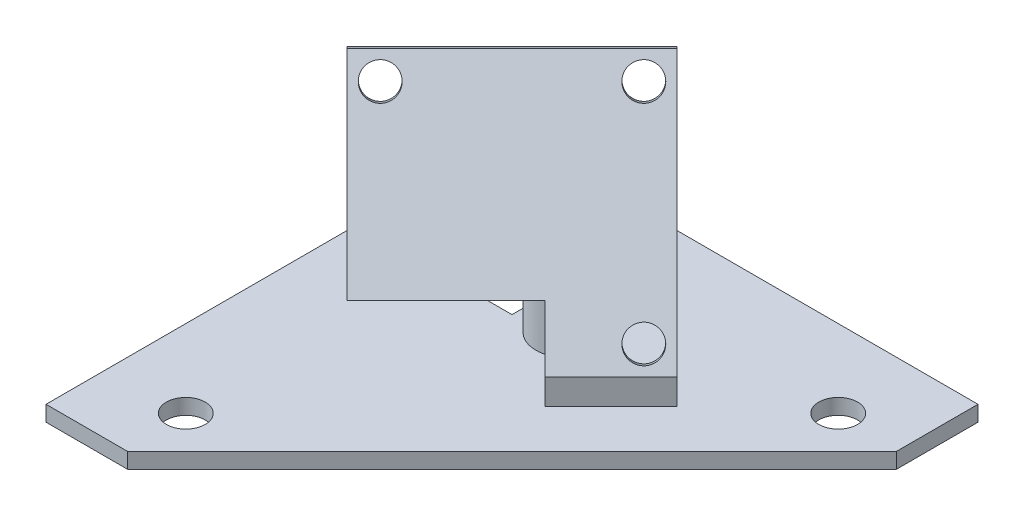
ISO-10303-21;
HEADER;
FILE_DESCRIPTION(('STEP AP214'),'2;1');
FILE_NAME('part.step','',(''),(''),'','','');
FILE_SCHEMA(('AUTOMOTIVE_DESIGN { 1 0 10303 214 1 1 1 1 }'));
ENDSEC;
DATA;
#1=APPLICATION_CONTEXT('core data for automotive mechanical design processes');
#2=APPLICATION_PROTOCOL_DEFINITION('international standard','automotive_design',2000,#1);
#3=PRODUCT_CONTEXT('',#1,'mechanical');
#4=PRODUCT('Part','Part','',(#3));
#5=PRODUCT_RELATED_PRODUCT_CATEGORY('part','',(#4));
#6=PRODUCT_DEFINITION_FORMATION('','',#4);
#7=PRODUCT_DEFINITION_CONTEXT('part definition',#1,'design');
#8=PRODUCT_DEFINITION('design','',#6,#7);
#9=PRODUCT_DEFINITION_SHAPE('','',#8);
#10=(LENGTH_UNIT() NAMED_UNIT(*) SI_UNIT(.MILLI.,.METRE.));
#11=(NAMED_UNIT(*) PLANE_ANGLE_UNIT() SI_UNIT($,.RADIAN.));
#12=(NAMED_UNIT(*) SI_UNIT($,.STERADIAN.) SOLID_ANGLE_UNIT());
#13=UNCERTAINTY_MEASURE_WITH_UNIT(LENGTH_MEASURE(1.E-05),#10,'distance_accuracy_value','');
#14=(GEOMETRIC_REPRESENTATION_CONTEXT(3) GLOBAL_UNCERTAINTY_ASSIGNED_CONTEXT((#13)) GLOBAL_UNIT_ASSIGNED_CONTEXT((#10,
#11,#12)) REPRESENTATION_CONTEXT('',''));
#15=CARTESIAN_POINT('',(0.,0.,0.));
#16=DIRECTION('',(0.,0.,1.));
#17=DIRECTION('',(1.,0.,0.));
#18=AXIS2_PLACEMENT_3D('',#15,#16,#17);
#19=CARTESIAN_POINT('',(0.,2.,0.));
#20=DIRECTION('',(0.,1.,0.));
#21=DIRECTION('',(0.,0.,1.));
#22=AXIS2_PLACEMENT_3D('',#19,#20,#21);
#23=PLANE('',#22);
#24=CARTESIAN_POINT('',(25.5115964232404,2.,18.4405286113749));
#25=DIRECTION('',(0.,1.,0.));
#26=DIRECTION('',(0.,0.,1.));
#27=AXIS2_PLACEMENT_3D('',#24,#25,#26);
#28=CIRCLE('',#27,4.);
#29=CARTESIAN_POINT('',(25.5115964232404,2.,22.4405286113749));
#30=VERTEX_POINT('',#29);
#31=EDGE_CURVE('E193',#30,#30,#28,.T.);
#32=ORIENTED_EDGE('',*,*,#31,.F.);
#33=EDGE_LOOP('',(#32));
#34=FACE_BOUND('',#33,.T.);
#35=CARTESIAN_POINT('',(52.,2.,10.));
#36=DIRECTION('',(0.,1.,0.));
#37=DIRECTION('',(0.,0.,1.));
#38=AXIS2_PLACEMENT_3D('',#35,#36,#37);
#39=CIRCLE('',#38,2.5);
#40=CARTESIAN_POINT('',(52.,2.,12.5));
#41=VERTEX_POINT('',#40);
#42=EDGE_CURVE('E161',#41,#41,#39,.T.);
#43=ORIENTED_EDGE('',*,*,#42,.F.);
#44=EDGE_LOOP('',(#43));
#45=FACE_BOUND('',#44,.T.);
#46=CARTESIAN_POINT('',(10.,2.,52.));
#47=DIRECTION('',(0.,1.,0.));
#48=DIRECTION('',(0.,0.,1.));
#49=AXIS2_PLACEMENT_3D('',#46,#47,#48);
#50=CIRCLE('',#49,2.5);
#51=CARTESIAN_POINT('',(10.,2.,54.5));
#52=VERTEX_POINT('',#51);
#53=EDGE_CURVE('E186',#52,#52,#50,.T.);
#54=ORIENTED_EDGE('',*,*,#53,.F.);
#55=EDGE_LOOP('',(#54));
#56=FACE_BOUND('',#55,.T.);
#57=DIRECTION('',(1.,0.,0.));
#58=VECTOR('',#57,1.);
#59=CARTESIAN_POINT('',(0.,2.,0.));
#60=LINE('',#59,#58);
#61=CARTESIAN_POINT('',(20.,2.,0.));
#62=VERTEX_POINT('',#61);
#63=CARTESIAN_POINT('',(60.,2.,0.));
#64=VERTEX_POINT('',#63);
#65=EDGE_CURVE('E182',#62,#64,#60,.T.);
#66=ORIENTED_EDGE('',*,*,#65,.F.);
#67=DIRECTION('',(0.,0.,1.));
#68=VECTOR('',#67,1.);
#69=CARTESIAN_POINT('',(20.,2.,0.));
#70=LINE('',#69,#68);
#71=CARTESIAN_POINT('',(20.,2.,20.));
#72=VERTEX_POINT('',#71);
#73=EDGE_CURVE('E180',#62,#72,#70,.T.);
#74=ORIENTED_EDGE('',*,*,#73,.T.);
#75=DIRECTION('',(1.,0.,0.));
#76=VECTOR('',#75,1.);
#77=CARTESIAN_POINT('',(0.,2.,20.));
#78=LINE('',#77,#76);
#79=CARTESIAN_POINT('',(0.,2.,20.));
#80=VERTEX_POINT('',#79);
#81=EDGE_CURVE('E171',#80,#72,#78,.T.);
#82=ORIENTED_EDGE('',*,*,#81,.F.);
#83=DIRECTION('',(0.,0.,1.));
#84=VECTOR('',#83,1.);
#85=CARTESIAN_POINT('',(0.,2.,0.));
#86=LINE('',#85,#84);
#87=CARTESIAN_POINT('',(0.,2.,60.));
#88=VERTEX_POINT('',#87);
#89=EDGE_CURVE('E116',#80,#88,#86,.T.);
#90=ORIENTED_EDGE('',*,*,#89,.T.);
#91=DIRECTION('',(1.,0.,0.));
#92=VECTOR('',#91,1.);
#93=CARTESIAN_POINT('',(0.,2.,60.));
#94=LINE('',#93,#92);
#95=CARTESIAN_POINT('',(10.5025253169417,2.,60.));
#96=VERTEX_POINT('',#95);
#97=EDGE_CURVE('E107',#88,#96,#94,.T.);
#98=ORIENTED_EDGE('',*,*,#97,.T.);
#99=DIRECTION('',(-0.707106781186548,0.,0.707106781186548));
#100=VECTOR('',#99,1.);
#101=CARTESIAN_POINT('',(35.2512626584708,2.,35.2512626584708));
#102=LINE('',#101,#100);
#103=CARTESIAN_POINT('',(60.,2.,10.5025253169417));
#104=VERTEX_POINT('',#103);
#105=EDGE_CURVE('E113',#104,#96,#102,.T.);
#106=ORIENTED_EDGE('',*,*,#105,.F.);
#107=DIRECTION('',(0.,0.,1.));
#108=VECTOR('',#107,1.);
#109=CARTESIAN_POINT('',(60.,2.,0.));
#110=LINE('',#109,#108);
#111=EDGE_CURVE('E132',#64,#104,#110,.T.);
#112=ORIENTED_EDGE('',*,*,#111,.F.);
#113=EDGE_LOOP('',(#66,#74,#82,#90,#98,#106,#112));
#114=FACE_BOUND('',#113,.T.);
#115=DIRECTION('',(-0.707106781186548,0.,0.707106781186548));
#116=VECTOR('',#115,1.);
#117=CARTESIAN_POINT('',(29.0471303291731,2.,29.0471303291731));
#118=LINE('',#117,#116);
#119=CARTESIAN_POINT('',(39.6537320469713,2.,18.4405286113749));
#120=VERTEX_POINT('',#119);
#121=CARTESIAN_POINT('',(31.1684506727327,2.,26.9258099856134));
#122=VERTEX_POINT('',#121);
#123=EDGE_CURVE('E50',#120,#122,#118,.T.);
#124=ORIENTED_EDGE('',*,*,#123,.F.);
#125=DIRECTION('',(-0.707106781186548,0.,-0.707106781186548));
#126=VECTOR('',#125,1.);
#127=CARTESIAN_POINT('',(10.6066017177982,2.,-10.6066017177982));
#128=LINE('',#127,#126);
#129=CARTESIAN_POINT('',(40.8784769183629,2.,19.6652734827664));
#130=VERTEX_POINT('',#129);
#131=EDGE_CURVE('E272',#130,#120,#128,.T.);
#132=ORIENTED_EDGE('',*,*,#131,.F.);
#133=DIRECTION('',(0.707106781186548,0.,-0.707106781186548));
#134=VECTOR('',#133,1.);
#135=CARTESIAN_POINT('',(30.2718752005647,2.,30.2718752005647));
#136=LINE('',#135,#134);
#137=CARTESIAN_POINT('',(32.3931955441243,2.,28.150554857005));
#138=VERTEX_POINT('',#137);
#139=EDGE_CURVE('E275',#138,#130,#136,.T.);
#140=ORIENTED_EDGE('',*,*,#139,.F.);
#141=DIRECTION('',(0.707106781186548,0.,0.707106781186548));
#142=VECTOR('',#141,1.);
#143=CARTESIAN_POINT('',(2.12132034355965,2.,-2.12132034355965));
#144=LINE('',#143,#142);
#145=EDGE_CURVE('E278',#122,#138,#144,.T.);
#146=ORIENTED_EDGE('',*,*,#145,.F.);
#147=EDGE_LOOP('',(#124,#132,#140,#146));
#148=FACE_BOUND('',#147,.T.);
#149=ADVANCED_FACE('F35',(#34,#45,#56,#114,#148),#23,.T.);
#150=CARTESIAN_POINT('',(0.,2.,0.));
#151=DIRECTION('',(0.,0.,-1.));
#152=DIRECTION('',(-1.,0.,0.));
#153=AXIS2_PLACEMENT_3D('',#150,#151,#152);
#154=PLANE('',#153);
#155=DIRECTION('',(1.,0.,0.));
#156=VECTOR('',#155,1.);
#157=CARTESIAN_POINT('',(0.,0.,0.));
#158=LINE('',#157,#156);
#159=CARTESIAN_POINT('',(20.,0.,0.));
#160=VERTEX_POINT('',#159);
#161=CARTESIAN_POINT('',(60.,0.,0.));
#162=VERTEX_POINT('',#161);
#163=EDGE_CURVE('E144',#160,#162,#158,.T.);
#164=ORIENTED_EDGE('',*,*,#163,.F.);
#165=DIRECTION('',(0.,-1.,0.));
#166=VECTOR('',#165,1.);
#167=CARTESIAN_POINT('',(20.,2.,0.));
#168=LINE('',#167,#166);
#169=EDGE_CURVE('E11',#62,#160,#168,.T.);
#170=ORIENTED_EDGE('',*,*,#169,.F.);
#171=ORIENTED_EDGE('',*,*,#65,.T.);
#172=DIRECTION('',(0.,-1.,0.));
#173=VECTOR('',#172,1.);
#174=CARTESIAN_POINT('',(60.,2.,0.));
#175=LINE('',#174,#173);
#176=EDGE_CURVE('E59',#64,#162,#175,.T.);
#177=ORIENTED_EDGE('',*,*,#176,.T.);
#178=EDGE_LOOP('',(#164,#170,#171,#177));
#179=FACE_BOUND('',#178,.T.);
#180=ADVANCED_FACE('F360',(#179),#154,.T.);
#181=CARTESIAN_POINT('',(20.,2.,0.));
#182=DIRECTION('',(1.,0.,0.));
#183=DIRECTION('',(0.,0.,-1.));
#184=AXIS2_PLACEMENT_3D('',#181,#182,#183);
#185=PLANE('',#184);
#186=DIRECTION('',(0.,0.,1.));
#187=VECTOR('',#186,1.);
#188=CARTESIAN_POINT('',(20.,0.,0.));
#189=LINE('',#188,#187);
#190=CARTESIAN_POINT('',(20.,0.,20.));
#191=VERTEX_POINT('',#190);
#192=EDGE_CURVE('E146',#160,#191,#189,.T.);
#193=ORIENTED_EDGE('',*,*,#192,.T.);
#194=DIRECTION('',(0.,-1.,0.));
#195=VECTOR('',#194,1.);
#196=CARTESIAN_POINT('',(20.,2.,20.));
#197=LINE('',#196,#195);
#198=EDGE_CURVE('E43',#72,#191,#197,.T.);
#199=ORIENTED_EDGE('',*,*,#198,.F.);
#200=ORIENTED_EDGE('',*,*,#73,.F.);
#201=ORIENTED_EDGE('',*,*,#169,.T.);
#202=EDGE_LOOP('',(#193,#199,#200,#201));
#203=FACE_BOUND('',#202,.T.);
#204=ADVANCED_FACE('F174',(#203),#185,.F.);
#205=CARTESIAN_POINT('',(0.,2.,20.));
#206=DIRECTION('',(0.,0.,-1.));
#207=DIRECTION('',(-1.,0.,0.));
#208=AXIS2_PLACEMENT_3D('',#205,#206,#207);
#209=PLANE('',#208);
#210=DIRECTION('',(1.,0.,0.));
#211=VECTOR('',#210,1.);
#212=CARTESIAN_POINT('',(0.,0.,20.));
#213=LINE('',#212,#211);
#214=CARTESIAN_POINT('',(0.,0.,20.));
#215=VERTEX_POINT('',#214);
#216=EDGE_CURVE('E149',#215,#191,#213,.T.);
#217=ORIENTED_EDGE('',*,*,#216,.F.);
#218=DIRECTION('',(0.,-1.,0.));
#219=VECTOR('',#218,1.);
#220=CARTESIAN_POINT('',(0.,2.,20.));
#221=LINE('',#220,#219);
#222=EDGE_CURVE('E165',#80,#215,#221,.T.);
#223=ORIENTED_EDGE('',*,*,#222,.F.);
#224=ORIENTED_EDGE('',*,*,#81,.T.);
#225=ORIENTED_EDGE('',*,*,#198,.T.);
#226=EDGE_LOOP('',(#217,#223,#224,#225));
#227=FACE_BOUND('',#226,.T.);
#228=ADVANCED_FACE('F170',(#227),#209,.T.);
#229=CARTESIAN_POINT('',(0.,2.,0.));
#230=DIRECTION('',(1.,0.,0.));
#231=DIRECTION('',(0.,0.,-1.));
#232=AXIS2_PLACEMENT_3D('',#229,#230,#231);
#233=PLANE('',#232);
#234=DIRECTION('',(0.,0.,1.));
#235=VECTOR('',#234,1.);
#236=CARTESIAN_POINT('',(0.,0.,0.));
#237=LINE('',#236,#235);
#238=CARTESIAN_POINT('',(0.,0.,60.));
#239=VERTEX_POINT('',#238);
#240=EDGE_CURVE('E152',#215,#239,#237,.T.);
#241=ORIENTED_EDGE('',*,*,#240,.T.);
#242=DIRECTION('',(0.,-1.,0.));
#243=VECTOR('',#242,1.);
#244=CARTESIAN_POINT('',(0.,2.,60.));
#245=LINE('',#244,#243);
#246=EDGE_CURVE('E128',#88,#239,#245,.T.);
#247=ORIENTED_EDGE('',*,*,#246,.F.);
#248=ORIENTED_EDGE('',*,*,#89,.F.);
#249=ORIENTED_EDGE('',*,*,#222,.T.);
#250=EDGE_LOOP('',(#241,#247,#248,#249));
#251=FACE_BOUND('',#250,.T.);
#252=ADVANCED_FACE('F179',(#251),#233,.F.);
#253=CARTESIAN_POINT('',(0.,2.,60.));
#254=DIRECTION('',(0.,0.,-1.));
#255=DIRECTION('',(-1.,0.,0.));
#256=AXIS2_PLACEMENT_3D('',#253,#254,#255);
#257=PLANE('',#256);
#258=DIRECTION('',(1.,0.,0.));
#259=VECTOR('',#258,1.);
#260=CARTESIAN_POINT('',(0.,0.,60.));
#261=LINE('',#260,#259);
#262=CARTESIAN_POINT('',(10.5025253169417,0.,60.));
#263=VERTEX_POINT('',#262);
#264=EDGE_CURVE('E124',#239,#263,#261,.T.);
#265=ORIENTED_EDGE('',*,*,#264,.T.);
#266=DIRECTION('',(0.,-1.,0.));
#267=VECTOR('',#266,1.);
#268=CARTESIAN_POINT('',(10.5025253169417,2.,60.));
#269=LINE('',#268,#267);
#270=EDGE_CURVE('E122',#96,#263,#269,.T.);
#271=ORIENTED_EDGE('',*,*,#270,.F.);
#272=ORIENTED_EDGE('',*,*,#97,.F.);
#273=ORIENTED_EDGE('',*,*,#246,.T.);
#274=EDGE_LOOP('',(#265,#271,#272,#273));
#275=FACE_BOUND('',#274,.T.);
#276=ADVANCED_FACE('F123',(#275),#257,.F.);
#277=CARTESIAN_POINT('',(35.2512626584708,2.,35.2512626584708));
#278=DIRECTION('',(0.707106781186547,0.,0.707106781186547));
#279=DIRECTION('',(0.707106781186548,0.,-0.707106781186548));
#280=AXIS2_PLACEMENT_3D('',#277,#278,#279);
#281=PLANE('',#280);
#282=DIRECTION('',(-0.707106781186548,0.,0.707106781186548));
#283=VECTOR('',#282,1.);
#284=CARTESIAN_POINT('',(35.2512626584708,0.,35.2512626584708));
#285=LINE('',#284,#283);
#286=CARTESIAN_POINT('',(60.,0.,10.5025253169417));
#287=VERTEX_POINT('',#286);
#288=EDGE_CURVE('E156',#287,#263,#285,.T.);
#289=ORIENTED_EDGE('',*,*,#288,.F.);
#290=DIRECTION('',(0.,-1.,0.));
#291=VECTOR('',#290,1.);
#292=CARTESIAN_POINT('',(60.,2.,10.5025253169417));
#293=LINE('',#292,#291);
#294=EDGE_CURVE('E129',#104,#287,#293,.T.);
#295=ORIENTED_EDGE('',*,*,#294,.F.);
#296=ORIENTED_EDGE('',*,*,#105,.T.);
#297=ORIENTED_EDGE('',*,*,#270,.T.);
#298=EDGE_LOOP('',(#289,#295,#296,#297));
#299=FACE_BOUND('',#298,.T.);
#300=ADVANCED_FACE('F131',(#299),#281,.T.);
#301=CARTESIAN_POINT('',(10.,2.,52.));
#302=DIRECTION('',(0.,-1.,0.));
#303=DIRECTION('',(0.,0.,-1.));
#304=AXIS2_PLACEMENT_3D('',#301,#302,#303);
#305=CYLINDRICAL_SURFACE('',#304,2.5);
#306=ORIENTED_EDGE('',*,*,#53,.T.);
#307=EDGE_LOOP('',(#306));
#308=FACE_BOUND('',#307,.T.);
#309=CARTESIAN_POINT('',(10.,0.,52.));
#310=DIRECTION('',(0.,1.,0.));
#311=DIRECTION('',(0.,0.,1.));
#312=AXIS2_PLACEMENT_3D('',#309,#310,#311);
#313=CIRCLE('',#312,2.5);
#314=CARTESIAN_POINT('',(10.,0.,54.5));
#315=VERTEX_POINT('',#314);
#316=EDGE_CURVE('E140',#315,#315,#313,.T.);
#317=ORIENTED_EDGE('',*,*,#316,.F.);
#318=EDGE_LOOP('',(#317));
#319=FACE_BOUND('',#318,.T.);
#320=ADVANCED_FACE('F383',(#308,#319),#305,.F.);
#321=CARTESIAN_POINT('',(52.,2.,10.));
#322=DIRECTION('',(0.,-1.,0.));
#323=DIRECTION('',(0.,0.,-1.));
#324=AXIS2_PLACEMENT_3D('',#321,#322,#323);
#325=CYLINDRICAL_SURFACE('',#324,2.5);
#326=ORIENTED_EDGE('',*,*,#42,.T.);
#327=EDGE_LOOP('',(#326));
#328=FACE_BOUND('',#327,.T.);
#329=CARTESIAN_POINT('',(52.,0.,10.));
#330=DIRECTION('',(0.,1.,0.));
#331=DIRECTION('',(0.,0.,1.));
#332=AXIS2_PLACEMENT_3D('',#329,#330,#331);
#333=CIRCLE('',#332,2.5);
#334=CARTESIAN_POINT('',(52.,0.,12.5));
#335=VERTEX_POINT('',#334);
#336=EDGE_CURVE('E137',#335,#335,#333,.T.);
#337=ORIENTED_EDGE('',*,*,#336,.F.);
#338=EDGE_LOOP('',(#337));
#339=FACE_BOUND('',#338,.T.);
#340=ADVANCED_FACE('F37',(#328,#339),#325,.F.);
#341=CARTESIAN_POINT('',(60.,2.,0.));
#342=DIRECTION('',(1.,0.,0.));
#343=DIRECTION('',(0.,0.,-1.));
#344=AXIS2_PLACEMENT_3D('',#341,#342,#343);
#345=PLANE('',#344);
#346=DIRECTION('',(0.,0.,1.));
#347=VECTOR('',#346,1.);
#348=CARTESIAN_POINT('',(60.,0.,0.));
#349=LINE('',#348,#347);
#350=EDGE_CURVE('E158',#162,#287,#349,.T.);
#351=ORIENTED_EDGE('',*,*,#350,.F.);
#352=ORIENTED_EDGE('',*,*,#176,.F.);
#353=ORIENTED_EDGE('',*,*,#111,.T.);
#354=ORIENTED_EDGE('',*,*,#294,.T.);
#355=EDGE_LOOP('',(#351,#352,#353,#354));
#356=FACE_BOUND('',#355,.T.);
#357=ADVANCED_FACE('F377',(#356),#345,.T.);
#358=CARTESIAN_POINT('',(0.,0.,0.));
#359=DIRECTION('',(0.,1.,0.));
#360=DIRECTION('',(0.,0.,1.));
#361=AXIS2_PLACEMENT_3D('',#358,#359,#360);
#362=PLANE('',#361);
#363=ORIENTED_EDGE('',*,*,#336,.T.);
#364=EDGE_LOOP('',(#363));
#365=FACE_BOUND('',#364,.T.);
#366=ORIENTED_EDGE('',*,*,#316,.T.);
#367=EDGE_LOOP('',(#366));
#368=FACE_BOUND('',#367,.T.);
#369=ORIENTED_EDGE('',*,*,#163,.T.);
#370=ORIENTED_EDGE('',*,*,#350,.T.);
#371=ORIENTED_EDGE('',*,*,#288,.T.);
#372=ORIENTED_EDGE('',*,*,#264,.F.);
#373=ORIENTED_EDGE('',*,*,#240,.F.);
#374=ORIENTED_EDGE('',*,*,#216,.T.);
#375=ORIENTED_EDGE('',*,*,#192,.F.);
#376=EDGE_LOOP('',(#369,#370,#371,#372,#373,#374,#375));
#377=FACE_BOUND('',#376,.T.);
#378=ADVANCED_FACE('F177',(#365,#368,#377),#362,.F.);
#379=CARTESIAN_POINT('',(25.5115964232404,38.6251153090657,18.4405286113749));
#380=DIRECTION('',(0.,-1.,0.));
#381=DIRECTION('',(0.,0.,-1.));
#382=AXIS2_PLACEMENT_3D('',#379,#380,#381);
#383=CYLINDRICAL_SURFACE('',#382,4.);
#384=ORIENTED_EDGE('',*,*,#31,.T.);
#385=EDGE_LOOP('',(#384));
#386=FACE_BOUND('',#385,.T.);
#387=CARTESIAN_POINT('',(25.5115964232404,21.6545525605885,18.4405286113749));
#388=DIRECTION('',(0.612372435695795,0.499999999999998,0.612372435695795));
#389=DIRECTION('',(0.353553390593273,-0.86602540378444,0.353553390593272));
#390=AXIS2_PLACEMENT_3D('',#387,#388,#389);
#391=ELLIPSE('',#390,8.00000000000004,4.);
#392=CARTESIAN_POINT('',(28.3400235479866,14.726349330313,21.2689557361211));
#393=VERTEX_POINT('',#392);
#394=EDGE_CURVE('E141',#393,#393,#391,.T.);
#395=ORIENTED_EDGE('',*,*,#394,.F.);
#396=EDGE_LOOP('',(#395));
#397=FACE_BOUND('',#396,.T.);
#398=ADVANCED_FACE('F373',(#386,#397),#383,.T.);
#399=CARTESIAN_POINT('',(26.4584376506471,19.8711730708738,22.2157969635278));
#400=DIRECTION('',(-0.707106781186547,0.,0.707106781186548));
#401=DIRECTION('',(0.707106781186548,0.,0.707106781186547));
#402=AXIS2_PLACEMENT_3D('',#399,#400,#401);
#403=PLANE('',#402);
#404=DIRECTION('',(-0.353553390593272,0.86602540378444,-0.353553390593272));
#405=VECTOR('',#404,1.);
#406=CARTESIAN_POINT('',(25.2336927792555,18.8711730708738,20.9910520921362));
#407=LINE('',#406,#405);
#408=CARTESIAN_POINT('',(31.1684506727327,4.33404448489977,26.9258099856134));
#409=VERTEX_POINT('',#408);
#410=CARTESIAN_POINT('',(28.6935769385798,10.3962223113909,24.4509362514605));
#411=VERTEX_POINT('',#410);
#412=EDGE_CURVE('E231',#409,#411,#407,.T.);
#413=ORIENTED_EDGE('',*,*,#412,.F.);
#414=DIRECTION('',(0.,-1.,0.));
#415=VECTOR('',#414,1.);
#416=CARTESIAN_POINT('',(31.1684506727327,500000.,26.9258099856134));
#417=LINE('',#416,#415);
#418=EDGE_CURVE('E237',#409,#122,#417,.T.);
#419=ORIENTED_EDGE('',*,*,#418,.T.);
#420=ORIENTED_EDGE('',*,*,#145,.T.);
#421=DIRECTION('',(0.,-1.,0.));
#422=VECTOR('',#421,1.);
#423=CARTESIAN_POINT('',(32.3931955441243,500000.,28.150554857005));
#424=LINE('',#423,#422);
#425=CARTESIAN_POINT('',(32.3931955441243,5.33404448486863,28.150554857005));
#426=VERTEX_POINT('',#425);
#427=EDGE_CURVE('E264',#426,#138,#424,.T.);
#428=ORIENTED_EDGE('',*,*,#427,.F.);
#429=DIRECTION('',(-0.353553390593272,0.86602540378444,-0.353553390593272));
#430=VECTOR('',#429,1.);
#431=CARTESIAN_POINT('',(26.4584376506471,19.8711730708738,22.2157969635278));
#432=LINE('',#431,#430);
#433=CARTESIAN_POINT('',(29.9183218099714,11.3962223113909,25.6756811228521));
#434=VERTEX_POINT('',#433);
#435=EDGE_CURVE('E258',#426,#434,#432,.T.);
#436=ORIENTED_EDGE('',*,*,#435,.T.);
#437=DIRECTION('',(-0.612372435695795,-0.499999999999998,-0.612372435695795));
#438=VECTOR('',#437,1.);
#439=CARTESIAN_POINT('',(29.9183218099714,11.3962223113909,25.6756811228521));
#440=LINE('',#439,#438);
#441=EDGE_CURVE('E205',#434,#411,#440,.T.);
#442=ORIENTED_EDGE('',*,*,#441,.T.);
#443=EDGE_LOOP('',(#413,#419,#420,#428,#436,#442));
#444=FACE_BOUND('',#443,.T.);
#445=ADVANCED_FACE('F287',(#444),#403,.T.);
#446=CARTESIAN_POINT('',(34.9437190248857,19.8711730708738,13.7305155892892));
#447=DIRECTION('',(-0.707106781186547,0.,0.707106781186548));
#448=DIRECTION('',(0.707106781186548,0.,0.707106781186547));
#449=AXIS2_PLACEMENT_3D('',#446,#447,#448);
#450=PLANE('',#449);
#451=DIRECTION('',(-0.353553390593273,0.86602540378444,-0.353553390593272));
#452=VECTOR('',#451,1.);
#453=CARTESIAN_POINT('',(33.7189741534941,18.8711730708738,12.5057707178976));
#454=LINE('',#453,#452);
#455=CARTESIAN_POINT('',(39.6537320469645,4.33404448487096,18.4405286113697));
#456=VERTEX_POINT('',#455);
#457=CARTESIAN_POINT('',(29.0471303291731,30.314806598433,7.83392689357668));
#458=VERTEX_POINT('',#457);
#459=EDGE_CURVE('E225',#456,#458,#454,.T.);
#460=ORIENTED_EDGE('',*,*,#459,.T.);
#461=DIRECTION('',(-0.612372435695795,-0.499999999999998,-0.612372435695795));
#462=VECTOR('',#461,1.);
#463=CARTESIAN_POINT('',(30.2718752005647,31.314806598433,9.05867176496827));
#464=LINE('',#463,#462);
#465=CARTESIAN_POINT('',(30.2718752005647,31.314806598433,9.05867176496827));
#466=VERTEX_POINT('',#465);
#467=EDGE_CURVE('E196',#466,#458,#464,.T.);
#468=ORIENTED_EDGE('',*,*,#467,.F.);
#469=DIRECTION('',(-0.353553390593273,0.86602540378444,-0.353553390593272));
#470=VECTOR('',#469,1.);
#471=CARTESIAN_POINT('',(34.9437190248857,19.8711730708738,13.7305155892892));
#472=LINE('',#471,#470);
#473=CARTESIAN_POINT('',(40.8784769183571,5.33404448486152,19.6652734827622));
#474=VERTEX_POINT('',#473);
#475=EDGE_CURVE('E252',#474,#466,#472,.T.);
#476=ORIENTED_EDGE('',*,*,#475,.F.);
#477=DIRECTION('',(0.,-1.,0.));
#478=VECTOR('',#477,1.);
#479=CARTESIAN_POINT('',(40.8784769183629,500000.,19.6652734827664));
#480=LINE('',#479,#478);
#481=EDGE_CURVE('E267',#474,#130,#480,.T.);
#482=ORIENTED_EDGE('',*,*,#481,.T.);
#483=ORIENTED_EDGE('',*,*,#131,.T.);
#484=DIRECTION('',(0.,-1.,0.));
#485=VECTOR('',#484,1.);
#486=CARTESIAN_POINT('',(39.6537320469713,500000.,18.4405286113749));
#487=LINE('',#486,#485);
#488=EDGE_CURVE('E270',#456,#120,#487,.T.);
#489=ORIENTED_EDGE('',*,*,#488,.F.);
#490=EDGE_LOOP('',(#460,#468,#476,#482,#483,#489));
#491=FACE_BOUND('',#490,.T.);
#492=ADVANCED_FACE('F336',(#491),#450,.F.);
#493=CARTESIAN_POINT('',(19.6652734827665,31.314806598433,19.6652734827665));
#494=DIRECTION('',(0.353553390593272,-0.86602540378444,0.353553390593272));
#495=DIRECTION('',(0.925820099772552,0.377964473009226,0.));
#496=AXIS2_PLACEMENT_3D('',#493,#494,#495);
#497=PLANE('',#496);
#498=DIRECTION('',(-0.707106781186547,0.,0.707106781186548));
#499=VECTOR('',#498,1.);
#500=CARTESIAN_POINT('',(18.4405286113749,30.314806598433,18.4405286113749));
#501=LINE('',#500,#499);
#502=CARTESIAN_POINT('',(7.83392689357669,30.314806598433,29.0471303291731));
#503=VERTEX_POINT('',#502);
#504=EDGE_CURVE('E222',#458,#503,#501,.T.);
#505=ORIENTED_EDGE('',*,*,#504,.T.);
#506=DIRECTION('',(-0.612372435695795,-0.499999999999998,-0.612372435695795));
#507=VECTOR('',#506,1.);
#508=CARTESIAN_POINT('',(9.05867176496828,31.314806598433,30.2718752005647));
#509=LINE('',#508,#507);
#510=CARTESIAN_POINT('',(9.05867176496828,31.314806598433,30.2718752005647));
#511=VERTEX_POINT('',#510);
#512=EDGE_CURVE('E199',#511,#503,#509,.T.);
#513=ORIENTED_EDGE('',*,*,#512,.F.);
#514=DIRECTION('',(-0.707106781186547,0.,0.707106781186548));
#515=VECTOR('',#514,1.);
#516=CARTESIAN_POINT('',(19.6652734827665,31.314806598433,19.6652734827665));
#517=LINE('',#516,#515);
#518=EDGE_CURVE('E249',#466,#511,#517,.T.);
#519=ORIENTED_EDGE('',*,*,#518,.F.);
#520=ORIENTED_EDGE('',*,*,#467,.T.);
#521=EDGE_LOOP('',(#505,#513,#519,#520));
#522=FACE_BOUND('',#521,.T.);
#523=ADVANCED_FACE('F340',(#522),#497,.F.);
#524=CARTESIAN_POINT('',(13.7305155892892,19.8711730708738,34.9437190248857));
#525=DIRECTION('',(-0.707106781186547,0.,0.707106781186548));
#526=DIRECTION('',(0.707106781186548,0.,0.707106781186547));
#527=AXIS2_PLACEMENT_3D('',#524,#525,#526);
#528=PLANE('',#527);
#529=DIRECTION('',(-0.353553390593273,0.86602540378444,-0.353553390593272));
#530=VECTOR('',#529,1.);
#531=CARTESIAN_POINT('',(12.5057707178976,18.8711730708738,33.7189741534941));
#532=LINE('',#531,#530);
#533=CARTESIAN_POINT('',(15.965654877222,10.3962223113909,37.1788583128184));
#534=VERTEX_POINT('',#533);
#535=EDGE_CURVE('E219',#534,#503,#532,.T.);
#536=ORIENTED_EDGE('',*,*,#535,.F.);
#537=DIRECTION('',(-0.612372435695795,-0.499999999999998,-0.612372435695795));
#538=VECTOR('',#537,1.);
#539=CARTESIAN_POINT('',(17.1903997486135,11.3962223113908,38.40360318421));
#540=LINE('',#539,#538);
#541=CARTESIAN_POINT('',(17.1903997486135,11.3962223113908,38.40360318421));
#542=VERTEX_POINT('',#541);
#543=EDGE_CURVE('E202',#542,#534,#540,.T.);
#544=ORIENTED_EDGE('',*,*,#543,.F.);
#545=DIRECTION('',(-0.353553390593273,0.86602540378444,-0.353553390593272));
#546=VECTOR('',#545,1.);
#547=CARTESIAN_POINT('',(13.7305155892892,19.8711730708738,34.9437190248857));
#548=LINE('',#547,#546);
#549=EDGE_CURVE('E246',#542,#511,#548,.T.);
#550=ORIENTED_EDGE('',*,*,#549,.T.);
#551=ORIENTED_EDGE('',*,*,#512,.T.);
#552=EDGE_LOOP('',(#536,#544,#550,#551));
#553=FACE_BOUND('',#552,.T.);
#554=ADVANCED_FACE('F347',(#553),#528,.T.);
#555=CARTESIAN_POINT('',(12.2406522803077,28.7167303870796,29.2112150287849));
#556=DIRECTION('',(-0.612372435695795,-0.499999999999998,-0.612372435695795));
#557=DIRECTION('',(-0.707106781186547,0.,0.707106781186548));
#558=AXIS2_PLACEMENT_3D('',#555,#556,#557);
#559=CYLINDRICAL_SURFACE('',#558,2.);
#560=CARTESIAN_POINT('',(12.2406522803077,28.7167303870796,29.2112150287849));
#561=DIRECTION('',(0.612372435695795,0.499999999999998,0.612372435695795));
#562=DIRECTION('',(0.707106781186547,0.,-0.707106781186548));
#563=AXIS2_PLACEMENT_3D('',#560,#561,#562);
#564=CIRCLE('',#563,2.);
#565=CARTESIAN_POINT('',(13.6548658426808,28.7167303870796,27.7970014664118));
#566=VERTEX_POINT('',#565);
#567=EDGE_CURVE('E240',#566,#566,#564,.T.);
#568=ORIENTED_EDGE('',*,*,#567,.T.);
#569=EDGE_LOOP('',(#568));
#570=FACE_BOUND('',#569,.T.);
#571=CARTESIAN_POINT('',(11.0159074089161,27.7167303870796,27.9864701573933));
#572=DIRECTION('',(0.612372435695795,0.499999999999998,0.612372435695795));
#573=DIRECTION('',(0.707106781186547,0.,-0.707106781186548));
#574=AXIS2_PLACEMENT_3D('',#571,#572,#573);
#575=CIRCLE('',#574,2.);
#576=CARTESIAN_POINT('',(12.4301209712892,27.7167303870796,26.5722565950202));
#577=VERTEX_POINT('',#576);
#578=EDGE_CURVE('E213',#577,#577,#575,.T.);
#579=ORIENTED_EDGE('',*,*,#578,.F.);
#580=EDGE_LOOP('',(#579));
#581=FACE_BOUND('',#580,.T.);
#582=ADVANCED_FACE('F349',(#570,#581),#559,.F.);
#583=CARTESIAN_POINT('',(27.7970014664118,11.3962223113909,27.7970014664118));
#584=DIRECTION('',(-0.353553390593273,0.86602540378444,-0.353553390593272));
#585=DIRECTION('',(-0.925820099772552,-0.377964473009226,0.));
#586=AXIS2_PLACEMENT_3D('',#583,#584,#585);
#587=PLANE('',#586);
#588=DIRECTION('',(0.707106781186547,0.,-0.707106781186548));
#589=VECTOR('',#588,1.);
#590=CARTESIAN_POINT('',(26.5722565950202,10.3962223113909,26.5722565950202));
#591=LINE('',#590,#589);
#592=EDGE_CURVE('E216',#534,#411,#591,.T.);
#593=ORIENTED_EDGE('',*,*,#592,.T.);
#594=ORIENTED_EDGE('',*,*,#441,.F.);
#595=DIRECTION('',(0.707106781186547,0.,-0.707106781186548));
#596=VECTOR('',#595,1.);
#597=CARTESIAN_POINT('',(27.7970014664118,11.3962223113909,27.7970014664118));
#598=LINE('',#597,#596);
#599=EDGE_CURVE('E243',#542,#434,#598,.T.);
#600=ORIENTED_EDGE('',*,*,#599,.F.);
#601=ORIENTED_EDGE('',*,*,#543,.T.);
#602=EDGE_LOOP('',(#593,#594,#600,#601));
#603=FACE_BOUND('',#602,.T.);
#604=ADVANCED_FACE('F328',(#603),#587,.F.);
#605=CARTESIAN_POINT('',(37.6964964030234,7.93212069625309,20.7259336545463));
#606=DIRECTION('',(-0.612372435695795,-0.499999999999998,-0.612372435695795));
#607=DIRECTION('',(-0.707106781186547,0.,0.707106781186548));
#608=AXIS2_PLACEMENT_3D('',#605,#606,#607);
#609=CYLINDRICAL_SURFACE('',#608,2.);
#610=CARTESIAN_POINT('',(37.6964964030234,7.93212069625309,20.7259336545463));
#611=DIRECTION('',(0.612372435695795,0.499999999999998,0.612372435695795));
#612=DIRECTION('',(0.707106781186547,0.,-0.707106781186548));
#613=AXIS2_PLACEMENT_3D('',#610,#611,#612);
#614=CIRCLE('',#613,2.);
#615=CARTESIAN_POINT('',(39.1107099653965,7.93212069625309,19.3117200921732));
#616=VERTEX_POINT('',#615);
#617=EDGE_CURVE('E212',#616,#616,#614,.T.);
#618=ORIENTED_EDGE('',*,*,#617,.T.);
#619=EDGE_LOOP('',(#618));
#620=FACE_BOUND('',#619,.T.);
#621=CARTESIAN_POINT('',(36.4717515316318,6.9321206962531,19.5011887831547));
#622=DIRECTION('',(0.612372435695795,0.499999999999998,0.612372435695795));
#623=DIRECTION('',(0.707106781186547,0.,-0.707106781186548));
#624=AXIS2_PLACEMENT_3D('',#621,#622,#623);
#625=CIRCLE('',#624,2.);
#626=CARTESIAN_POINT('',(37.8859650940049,6.9321206962531,18.0869752207816));
#627=VERTEX_POINT('',#626);
#628=EDGE_CURVE('E234',#627,#627,#625,.T.);
#629=ORIENTED_EDGE('',*,*,#628,.F.);
#630=EDGE_LOOP('',(#629));
#631=FACE_BOUND('',#630,.T.);
#632=ADVANCED_FACE('F445',(#620,#631),#609,.F.);
#633=CARTESIAN_POINT('',(29.2112150287849,28.7167303870796,12.2406522803077));
#634=DIRECTION('',(-0.612372435695795,-0.499999999999998,-0.612372435695795));
#635=DIRECTION('',(-0.707106781186547,0.,0.707106781186548));
#636=AXIS2_PLACEMENT_3D('',#633,#634,#635);
#637=CYLINDRICAL_SURFACE('',#636,2.);
#638=CARTESIAN_POINT('',(29.2112150287849,28.7167303870796,12.2406522803077));
#639=DIRECTION('',(0.612372435695795,0.499999999999998,0.612372435695795));
#640=DIRECTION('',(0.707106781186547,0.,-0.707106781186548));
#641=AXIS2_PLACEMENT_3D('',#638,#639,#640);
#642=CIRCLE('',#641,2.);
#643=CARTESIAN_POINT('',(30.625428591158,28.7167303870796,10.8264387179346));
#644=VERTEX_POINT('',#643);
#645=EDGE_CURVE('E208',#644,#644,#642,.F.);
#646=ORIENTED_EDGE('',*,*,#645,.F.);
#647=EDGE_LOOP('',(#646));
#648=FACE_BOUND('',#647,.T.);
#649=CARTESIAN_POINT('',(27.9864701573933,27.7167303870796,11.0159074089161));
#650=DIRECTION('',(0.612372435695795,0.499999999999998,0.612372435695795));
#651=DIRECTION('',(0.707106781186547,0.,-0.707106781186548));
#652=AXIS2_PLACEMENT_3D('',#649,#650,#651);
#653=CIRCLE('',#652,2.);
#654=CARTESIAN_POINT('',(29.4006837197664,27.7167303870796,9.60169384654304));
#655=VERTEX_POINT('',#654);
#656=EDGE_CURVE('E209',#655,#655,#653,.F.);
#657=ORIENTED_EDGE('',*,*,#656,.T.);
#658=EDGE_LOOP('',(#657));
#659=FACE_BOUND('',#658,.T.);
#660=ADVANCED_FACE('F452',(#648,#659),#637,.F.);
#661=CARTESIAN_POINT('',(24.3371173070874,19.8711730708738,24.3371173070874));
#662=DIRECTION('',(0.612372435695795,0.499999999999998,0.612372435695795));
#663=DIRECTION('',(0.707106781186547,0.,-0.707106781186548));
#664=AXIS2_PLACEMENT_3D('',#661,#662,#663);
#665=PLANE('',#664);
#666=ORIENTED_EDGE('',*,*,#617,.F.);
#667=EDGE_LOOP('',(#666));
#668=FACE_BOUND('',#667,.T.);
#669=ORIENTED_EDGE('',*,*,#435,.F.);
#670=DIRECTION('',(-0.707106781186548,0.,0.707106781186548));
#671=VECTOR('',#670,1.);
#672=CARTESIAN_POINT('',(30.2718752005647,5.33404448489977,30.2718752005647));
#673=LINE('',#672,#671);
#674=EDGE_CURVE('E255',#474,#426,#673,.T.);
#675=ORIENTED_EDGE('',*,*,#674,.F.);
#676=ORIENTED_EDGE('',*,*,#475,.T.);
#677=ORIENTED_EDGE('',*,*,#518,.T.);
#678=ORIENTED_EDGE('',*,*,#549,.F.);
#679=ORIENTED_EDGE('',*,*,#599,.T.);
#680=EDGE_LOOP('',(#669,#675,#676,#677,#678,#679));
#681=FACE_BOUND('',#680,.T.);
#682=ORIENTED_EDGE('',*,*,#567,.F.);
#683=EDGE_LOOP('',(#682));
#684=FACE_BOUND('',#683,.T.);
#685=ORIENTED_EDGE('',*,*,#645,.T.);
#686=EDGE_LOOP('',(#685));
#687=FACE_BOUND('',#686,.T.);
#688=ADVANCED_FACE('F344',(#668,#681,#684,#687),#665,.T.);
#689=CARTESIAN_POINT('',(23.1123724356959,18.8711730708738,23.1123724356959));
#690=DIRECTION('',(0.612372435695795,0.499999999999998,0.612372435695795));
#691=DIRECTION('',(0.707106781186547,0.,-0.707106781186548));
#692=AXIS2_PLACEMENT_3D('',#689,#690,#691);
#693=PLANE('',#692);
#694=ORIENTED_EDGE('',*,*,#394,.T.);
#695=EDGE_LOOP('',(#694));
#696=FACE_BOUND('',#695,.T.);
#697=ORIENTED_EDGE('',*,*,#628,.T.);
#698=EDGE_LOOP('',(#697));
#699=FACE_BOUND('',#698,.T.);
#700=ORIENTED_EDGE('',*,*,#412,.T.);
#701=ORIENTED_EDGE('',*,*,#592,.F.);
#702=ORIENTED_EDGE('',*,*,#535,.T.);
#703=ORIENTED_EDGE('',*,*,#504,.F.);
#704=ORIENTED_EDGE('',*,*,#459,.F.);
#705=DIRECTION('',(-0.707106781186548,0.,0.707106781186548));
#706=VECTOR('',#705,1.);
#707=CARTESIAN_POINT('',(29.0471303291731,4.33404448489977,29.0471303291731));
#708=LINE('',#707,#706);
#709=EDGE_CURVE('E228',#456,#409,#708,.T.);
#710=ORIENTED_EDGE('',*,*,#709,.T.);
#711=EDGE_LOOP('',(#700,#701,#702,#703,#704,#710));
#712=FACE_BOUND('',#711,.T.);
#713=ORIENTED_EDGE('',*,*,#578,.T.);
#714=EDGE_LOOP('',(#713));
#715=FACE_BOUND('',#714,.T.);
#716=ORIENTED_EDGE('',*,*,#656,.F.);
#717=EDGE_LOOP('',(#716));
#718=FACE_BOUND('',#717,.T.);
#719=ADVANCED_FACE('F331',(#696,#699,#712,#715,#718),#693,.F.);
#720=CARTESIAN_POINT('',(29.0471303291731,500000.,29.0471303291731));
#721=DIRECTION('',(0.707106781186547,0.,0.707106781186547));
#722=DIRECTION('',(0.707106781186548,0.,-0.707106781186548));
#723=AXIS2_PLACEMENT_3D('',#720,#721,#722);
#724=PLANE('',#723);
#725=ORIENTED_EDGE('',*,*,#709,.F.);
#726=ORIENTED_EDGE('',*,*,#488,.T.);
#727=ORIENTED_EDGE('',*,*,#123,.T.);
#728=ORIENTED_EDGE('',*,*,#418,.F.);
#729=EDGE_LOOP('',(#725,#726,#727,#728));
#730=FACE_BOUND('',#729,.T.);
#731=ADVANCED_FACE('F335',(#730),#724,.F.);
#732=CARTESIAN_POINT('',(30.2718752005647,500000.,30.2718752005647));
#733=DIRECTION('',(-0.707106781186547,0.,-0.707106781186547));
#734=DIRECTION('',(-0.707106781186548,0.,0.707106781186548));
#735=AXIS2_PLACEMENT_3D('',#732,#733,#734);
#736=PLANE('',#735);
#737=ORIENTED_EDGE('',*,*,#481,.F.);
#738=ORIENTED_EDGE('',*,*,#674,.T.);
#739=ORIENTED_EDGE('',*,*,#427,.T.);
#740=ORIENTED_EDGE('',*,*,#139,.T.);
#741=EDGE_LOOP('',(#737,#738,#739,#740));
#742=FACE_BOUND('',#741,.T.);
#743=ADVANCED_FACE('F295',(#742),#736,.F.);
#744=CLOSED_SHELL('',(#149,#180,#204,#228,#252,#276,#300,#320,#340,#357,#378,#398,#445,#492,
#523,#554,#582,#604,#632,#660,#688,#719,#731,#743));
#745=MANIFOLD_SOLID_BREP('B2',#744);
#746=ADVANCED_BREP_SHAPE_REPRESENTATION('',(#18,#745),#14);
#747=SHAPE_DEFINITION_REPRESENTATION(#9,#746);
ENDSEC;
END-ISO-10303-21;
